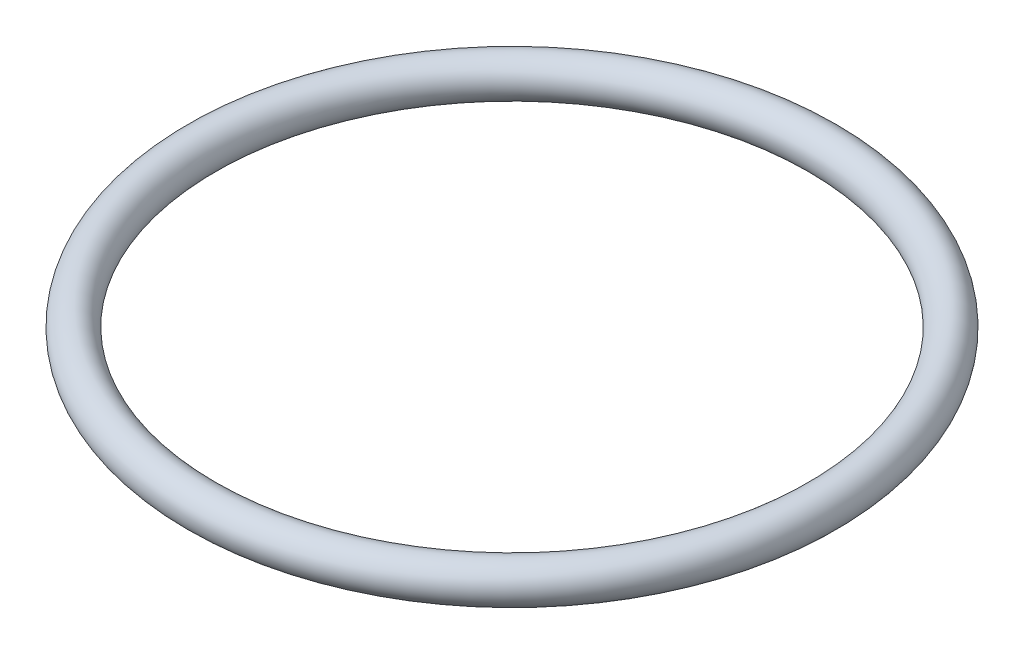
ISO-10303-21;
HEADER;
FILE_DESCRIPTION(('STEP AP214'),'2;1');
FILE_NAME('part.step','',(''),(''),'','','');
FILE_SCHEMA(('AUTOMOTIVE_DESIGN { 1 0 10303 214 1 1 1 1 }'));
ENDSEC;
DATA;
#1=APPLICATION_CONTEXT('core data for automotive mechanical design processes');
#2=APPLICATION_PROTOCOL_DEFINITION('international standard','automotive_design',2000,#1);
#3=PRODUCT_CONTEXT('',#1,'mechanical');
#4=PRODUCT('Part','Part','',(#3));
#5=PRODUCT_RELATED_PRODUCT_CATEGORY('part','',(#4));
#6=PRODUCT_DEFINITION_FORMATION('','',#4);
#7=PRODUCT_DEFINITION_CONTEXT('part definition',#1,'design');
#8=PRODUCT_DEFINITION('design','',#6,#7);
#9=PRODUCT_DEFINITION_SHAPE('','',#8);
#10=(LENGTH_UNIT() NAMED_UNIT(*) SI_UNIT(.MILLI.,.METRE.));
#11=(NAMED_UNIT(*) PLANE_ANGLE_UNIT() SI_UNIT($,.RADIAN.));
#12=(NAMED_UNIT(*) SI_UNIT($,.STERADIAN.) SOLID_ANGLE_UNIT());
#13=UNCERTAINTY_MEASURE_WITH_UNIT(LENGTH_MEASURE(1.E-05),#10,'distance_accuracy_value','');
#14=(GEOMETRIC_REPRESENTATION_CONTEXT(3) GLOBAL_UNCERTAINTY_ASSIGNED_CONTEXT((#13)) GLOBAL_UNIT_ASSIGNED_CONTEXT((#10,
#11,#12)) REPRESENTATION_CONTEXT('',''));
#15=CARTESIAN_POINT('',(0.,0.,0.));
#16=DIRECTION('',(0.,0.,1.));
#17=DIRECTION('',(1.,0.,0.));
#18=AXIS2_PLACEMENT_3D('',#15,#16,#17);
#19=CARTESIAN_POINT('',(0.,0.,0.));
#20=DIRECTION('',(0.,-1.,0.));
#21=DIRECTION('',(0.,0.,-1.));
#22=AXIS2_PLACEMENT_3D('',#19,#20,#21);
#23=TOROIDAL_SURFACE('',#22,40.,2.50000000000001);
#24=CARTESIAN_POINT('',(0.,0.,-42.5));
#25=VERTEX_POINT('',#24);
#26=VERTEX_LOOP('',#25);
#27=FACE_BOUND('',#26,.T.);
#28=ADVANCED_FACE('F36',(#27),#23,.T.);
#29=CLOSED_SHELL('',(#28));
#30=MANIFOLD_SOLID_BREP('B2',#29);
#31=ADVANCED_BREP_SHAPE_REPRESENTATION('',(#18,#30),#14);
#32=SHAPE_DEFINITION_REPRESENTATION(#9,#31);
ENDSEC;
END-ISO-10303-21;
